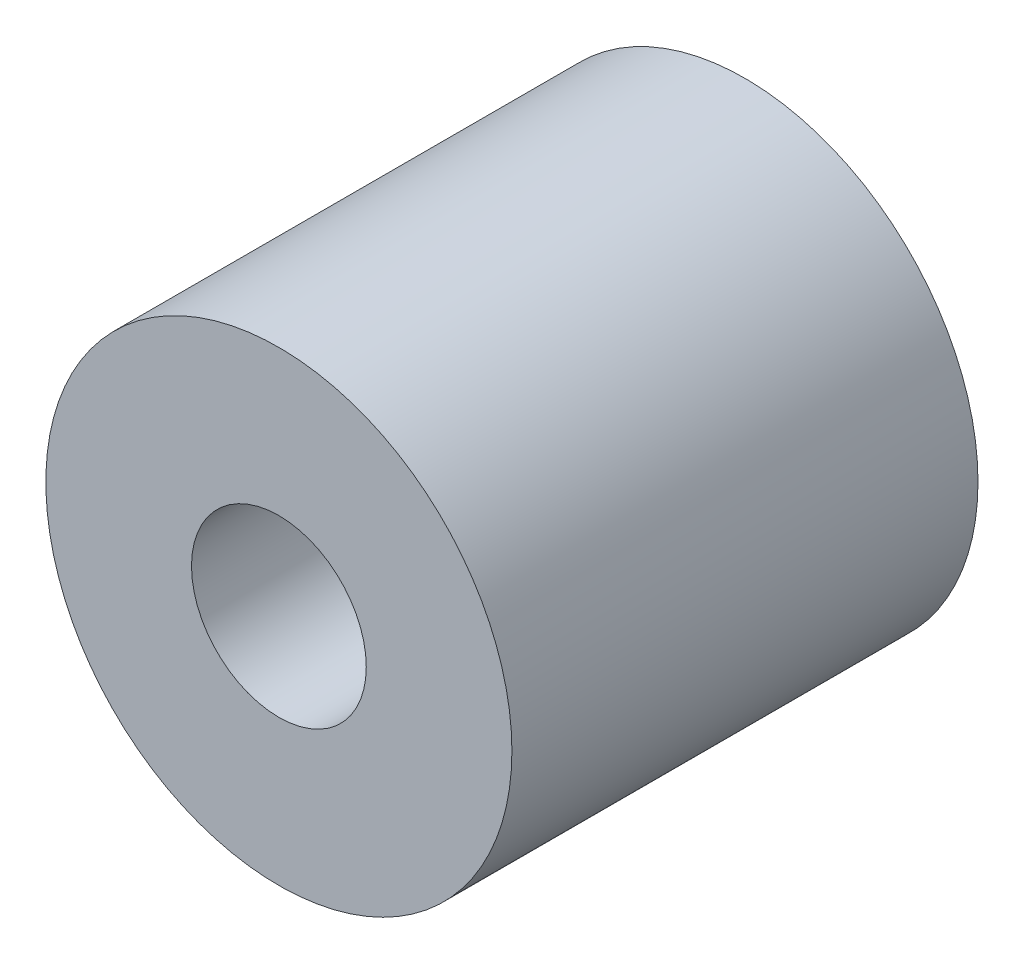
ISO-10303-21;
HEADER;
FILE_DESCRIPTION(('STEP AP214'),'2;1');
FILE_NAME('part.step','',(''),(''),'','','');
FILE_SCHEMA(('AUTOMOTIVE_DESIGN { 1 0 10303 214 1 1 1 1 }'));
ENDSEC;
DATA;
#1=APPLICATION_CONTEXT('core data for automotive mechanical design processes');
#2=APPLICATION_PROTOCOL_DEFINITION('international standard','automotive_design',2000,#1);
#3=PRODUCT_CONTEXT('',#1,'mechanical');
#4=PRODUCT('Part','Part','',(#3));
#5=PRODUCT_RELATED_PRODUCT_CATEGORY('part','',(#4));
#6=PRODUCT_DEFINITION_FORMATION('','',#4);
#7=PRODUCT_DEFINITION_CONTEXT('part definition',#1,'design');
#8=PRODUCT_DEFINITION('design','',#6,#7);
#9=PRODUCT_DEFINITION_SHAPE('','',#8);
#10=(LENGTH_UNIT() NAMED_UNIT(*) SI_UNIT(.MILLI.,.METRE.));
#11=(NAMED_UNIT(*) PLANE_ANGLE_UNIT() SI_UNIT($,.RADIAN.));
#12=(NAMED_UNIT(*) SI_UNIT($,.STERADIAN.) SOLID_ANGLE_UNIT());
#13=UNCERTAINTY_MEASURE_WITH_UNIT(LENGTH_MEASURE(1.E-05),#10,'distance_accuracy_value','');
#14=(GEOMETRIC_REPRESENTATION_CONTEXT(3) GLOBAL_UNCERTAINTY_ASSIGNED_CONTEXT((#13)) GLOBAL_UNIT_ASSIGNED_CONTEXT((#10,
#11,#12)) REPRESENTATION_CONTEXT('',''));
#15=CARTESIAN_POINT('',(0.,0.,0.));
#16=DIRECTION('',(0.,0.,1.));
#17=DIRECTION('',(1.,0.,0.));
#18=AXIS2_PLACEMENT_3D('',#15,#16,#17);
#19=CARTESIAN_POINT('',(0.,0.,8.));
#20=DIRECTION('',(0.,0.,-1.));
#21=DIRECTION('',(-1.,0.,0.));
#22=AXIS2_PLACEMENT_3D('',#19,#20,#21);
#23=CYLINDRICAL_SURFACE('',#22,3.075);
#24=CARTESIAN_POINT('',(0.,0.,0.200000000000003));
#25=DIRECTION('',(0.,0.,1.));
#26=DIRECTION('',(1.,0.,0.));
#27=AXIS2_PLACEMENT_3D('',#24,#25,#26);
#28=CIRCLE('',#27,3.075);
#29=CARTESIAN_POINT('',(3.075,0.,0.200000000000003));
#30=VERTEX_POINT('',#29);
#31=EDGE_CURVE('E11',#30,#30,#28,.F.);
#32=ORIENTED_EDGE('',*,*,#31,.T.);
#33=EDGE_LOOP('',(#32));
#34=FACE_BOUND('',#33,.T.);
#35=CARTESIAN_POINT('',(0.,0.,2.5));
#36=DIRECTION('',(0.,0.,1.));
#37=DIRECTION('',(1.,0.,0.));
#38=AXIS2_PLACEMENT_3D('',#35,#36,#37);
#39=CIRCLE('',#38,3.075);
#40=CARTESIAN_POINT('',(3.075,0.,2.5));
#41=VERTEX_POINT('',#40);
#42=EDGE_CURVE('E70',#41,#41,#39,.F.);
#43=ORIENTED_EDGE('',*,*,#42,.F.);
#44=EDGE_LOOP('',(#43));
#45=FACE_BOUND('',#44,.T.);
#46=ADVANCED_FACE('F41',(#34,#45),#23,.F.);
#47=CARTESIAN_POINT('',(0.,0.,8.));
#48=DIRECTION('',(0.,0.,1.));
#49=DIRECTION('',(1.,0.,0.));
#50=AXIS2_PLACEMENT_3D('',#47,#48,#49);
#51=PLANE('',#50);
#52=CARTESIAN_POINT('',(0.,0.,8.));
#53=DIRECTION('',(0.,0.,1.));
#54=DIRECTION('',(1.,0.,0.));
#55=AXIS2_PLACEMENT_3D('',#52,#53,#54);
#56=CIRCLE('',#55,4.);
#57=CARTESIAN_POINT('',(4.,0.,8.));
#58=VERTEX_POINT('',#57);
#59=EDGE_CURVE('E55',#58,#58,#56,.T.);
#60=ORIENTED_EDGE('',*,*,#59,.T.);
#61=EDGE_LOOP('',(#60));
#62=FACE_BOUND('',#61,.T.);
#63=CARTESIAN_POINT('',(0.,0.,8.));
#64=DIRECTION('',(0.,0.,1.));
#65=DIRECTION('',(1.,0.,0.));
#66=AXIS2_PLACEMENT_3D('',#63,#64,#65);
#67=CIRCLE('',#66,1.5);
#68=CARTESIAN_POINT('',(1.5,0.,8.));
#69=VERTEX_POINT('',#68);
#70=EDGE_CURVE('E71',#69,#69,#67,.T.);
#71=ORIENTED_EDGE('',*,*,#70,.F.);
#72=EDGE_LOOP('',(#71));
#73=FACE_BOUND('',#72,.T.);
#74=ADVANCED_FACE('F83',(#62,#73),#51,.T.);
#75=CARTESIAN_POINT('',(0.,0.,0.));
#76=DIRECTION('',(0.,0.,1.));
#77=DIRECTION('',(1.,0.,0.));
#78=AXIS2_PLACEMENT_3D('',#75,#76,#77);
#79=PLANE('',#78);
#80=CARTESIAN_POINT('',(0.,0.,0.));
#81=DIRECTION('',(0.,0.,1.));
#82=DIRECTION('',(1.,0.,0.));
#83=AXIS2_PLACEMENT_3D('',#80,#81,#82);
#84=CIRCLE('',#83,3.275);
#85=CARTESIAN_POINT('',(3.275,0.,0.));
#86=VERTEX_POINT('',#85);
#87=EDGE_CURVE('E50',#86,#86,#84,.T.);
#88=ORIENTED_EDGE('',*,*,#87,.T.);
#89=EDGE_LOOP('',(#88));
#90=FACE_BOUND('',#89,.T.);
#91=CARTESIAN_POINT('',(0.,0.,0.));
#92=DIRECTION('',(0.,0.,1.));
#93=DIRECTION('',(1.,0.,0.));
#94=AXIS2_PLACEMENT_3D('',#91,#92,#93);
#95=CIRCLE('',#94,4.);
#96=CARTESIAN_POINT('',(4.,0.,0.));
#97=VERTEX_POINT('',#96);
#98=EDGE_CURVE('E60',#97,#97,#95,.T.);
#99=ORIENTED_EDGE('',*,*,#98,.F.);
#100=EDGE_LOOP('',(#99));
#101=FACE_BOUND('',#100,.T.);
#102=ADVANCED_FACE('F88',(#90,#101),#79,.F.);
#103=CARTESIAN_POINT('',(0.,0.,8.));
#104=DIRECTION('',(0.,0.,-1.));
#105=DIRECTION('',(-1.,0.,0.));
#106=AXIS2_PLACEMENT_3D('',#103,#104,#105);
#107=CYLINDRICAL_SURFACE('',#106,4.);
#108=ORIENTED_EDGE('',*,*,#59,.F.);
#109=EDGE_LOOP('',(#108));
#110=FACE_BOUND('',#109,.T.);
#111=ORIENTED_EDGE('',*,*,#98,.T.);
#112=EDGE_LOOP('',(#111));
#113=FACE_BOUND('',#112,.T.);
#114=ADVANCED_FACE('F96',(#110,#113),#107,.T.);
#115=CARTESIAN_POINT('',(0.,0.,-8.69741340859454));
#116=DIRECTION('',(0.,0.,1.));
#117=DIRECTION('',(1.,0.,0.));
#118=AXIS2_PLACEMENT_3D('',#115,#116,#117);
#119=CYLINDRICAL_SURFACE('',#118,1.5);
#120=CARTESIAN_POINT('',(0.,0.,2.5));
#121=DIRECTION('',(0.,0.,1.));
#122=DIRECTION('',(1.,0.,0.));
#123=AXIS2_PLACEMENT_3D('',#120,#121,#122);
#124=CIRCLE('',#123,1.5);
#125=CARTESIAN_POINT('',(1.5,0.,2.5));
#126=VERTEX_POINT('',#125);
#127=EDGE_CURVE('E65',#126,#126,#124,.F.);
#128=ORIENTED_EDGE('',*,*,#127,.T.);
#129=EDGE_LOOP('',(#128));
#130=FACE_BOUND('',#129,.T.);
#131=ORIENTED_EDGE('',*,*,#70,.T.);
#132=EDGE_LOOP('',(#131));
#133=FACE_BOUND('',#132,.T.);
#134=ADVANCED_FACE('F92',(#130,#133),#119,.F.);
#135=CARTESIAN_POINT('',(0.,0.,2.5));
#136=DIRECTION('',(0.,0.,1.));
#137=DIRECTION('',(1.,0.,0.));
#138=AXIS2_PLACEMENT_3D('',#135,#136,#137);
#139=PLANE('',#138);
#140=ORIENTED_EDGE('',*,*,#42,.T.);
#141=EDGE_LOOP('',(#140));
#142=FACE_BOUND('',#141,.T.);
#143=ORIENTED_EDGE('',*,*,#127,.F.);
#144=EDGE_LOOP('',(#143));
#145=FACE_BOUND('',#144,.T.);
#146=ADVANCED_FACE('F79',(#142,#145),#139,.F.);
#147=CARTESIAN_POINT('',(0.,0.,0.));
#148=DIRECTION('',(0.,0.,-1.));
#149=DIRECTION('',(-1.,0.,0.));
#150=AXIS2_PLACEMENT_3D('',#147,#148,#149);
#151=CONICAL_SURFACE('',#150,3.275,0.785398163397443);
#152=ORIENTED_EDGE('',*,*,#31,.F.);
#153=EDGE_LOOP('',(#152));
#154=FACE_BOUND('',#153,.T.);
#155=ORIENTED_EDGE('',*,*,#87,.F.);
#156=EDGE_LOOP('',(#155));
#157=FACE_BOUND('',#156,.T.);
#158=ADVANCED_FACE('F44',(#154,#157),#151,.F.);
#159=CLOSED_SHELL('',(#46,#74,#102,#114,#134,#146,#158));
#160=MANIFOLD_SOLID_BREP('B2',#159);
#161=ADVANCED_BREP_SHAPE_REPRESENTATION('',(#18,#160),#14);
#162=SHAPE_DEFINITION_REPRESENTATION(#9,#161);
ENDSEC;
END-ISO-10303-21;
